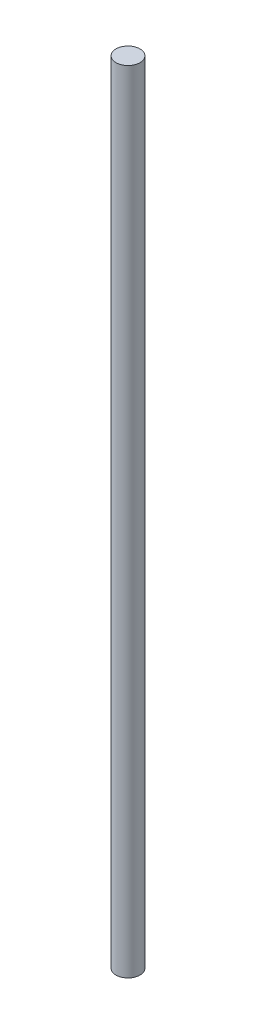
ISO-10303-21;
HEADER;
FILE_DESCRIPTION(('STEP AP214'),'2;1');
FILE_NAME('part.step','',(''),(''),'','','');
FILE_SCHEMA(('AUTOMOTIVE_DESIGN { 1 0 10303 214 1 1 1 1 }'));
ENDSEC;
DATA;
#1=APPLICATION_CONTEXT('core data for automotive mechanical design processes');
#2=APPLICATION_PROTOCOL_DEFINITION('international standard','automotive_design',2000,#1);
#3=PRODUCT_CONTEXT('',#1,'mechanical');
#4=PRODUCT('Part','Part','',(#3));
#5=PRODUCT_RELATED_PRODUCT_CATEGORY('part','',(#4));
#6=PRODUCT_DEFINITION_FORMATION('','',#4);
#7=PRODUCT_DEFINITION_CONTEXT('part definition',#1,'design');
#8=PRODUCT_DEFINITION('design','',#6,#7);
#9=PRODUCT_DEFINITION_SHAPE('','',#8);
#10=(LENGTH_UNIT() NAMED_UNIT(*) SI_UNIT(.MILLI.,.METRE.));
#11=(NAMED_UNIT(*) PLANE_ANGLE_UNIT() SI_UNIT($,.RADIAN.));
#12=(NAMED_UNIT(*) SI_UNIT($,.STERADIAN.) SOLID_ANGLE_UNIT());
#13=UNCERTAINTY_MEASURE_WITH_UNIT(LENGTH_MEASURE(1.E-05),#10,'distance_accuracy_value','');
#14=(GEOMETRIC_REPRESENTATION_CONTEXT(3) GLOBAL_UNCERTAINTY_ASSIGNED_CONTEXT((#13)) GLOBAL_UNIT_ASSIGNED_CONTEXT((#10,
#11,#12)) REPRESENTATION_CONTEXT('',''));
#15=CARTESIAN_POINT('',(0.,0.,0.));
#16=DIRECTION('',(0.,0.,1.));
#17=DIRECTION('',(1.,0.,0.));
#18=AXIS2_PLACEMENT_3D('',#15,#16,#17);
#19=CARTESIAN_POINT('',(0.,330.2,0.));
#20=DIRECTION('',(0.,-1.,0.));
#21=DIRECTION('',(0.,0.,-1.));
#22=AXIS2_PLACEMENT_3D('',#19,#20,#21);
#23=CYLINDRICAL_SURFACE('',#22,5.);
#24=CARTESIAN_POINT('',(0.,330.2,0.));
#25=DIRECTION('',(0.,1.,0.));
#26=DIRECTION('',(0.,0.,1.));
#27=AXIS2_PLACEMENT_3D('',#24,#25,#26);
#28=CIRCLE('',#27,5.);
#29=CARTESIAN_POINT('',(0.,330.2,5.));
#30=VERTEX_POINT('',#29);
#31=EDGE_CURVE('E10',#30,#30,#28,.T.);
#32=ORIENTED_EDGE('',*,*,#31,.F.);
#33=EDGE_LOOP('',(#32));
#34=FACE_BOUND('',#33,.T.);
#35=CARTESIAN_POINT('',(0.,0.,0.));
#36=DIRECTION('',(0.,1.,0.));
#37=DIRECTION('',(0.,0.,1.));
#38=AXIS2_PLACEMENT_3D('',#35,#36,#37);
#39=CIRCLE('',#38,5.);
#40=CARTESIAN_POINT('',(0.,0.,5.));
#41=VERTEX_POINT('',#40);
#42=EDGE_CURVE('E36',#41,#41,#39,.T.);
#43=ORIENTED_EDGE('',*,*,#42,.T.);
#44=EDGE_LOOP('',(#43));
#45=FACE_BOUND('',#44,.T.);
#46=ADVANCED_FACE('F33',(#34,#45),#23,.T.);
#47=CARTESIAN_POINT('',(0.,330.2,0.));
#48=DIRECTION('',(0.,1.,0.));
#49=DIRECTION('',(0.,0.,1.));
#50=AXIS2_PLACEMENT_3D('',#47,#48,#49);
#51=PLANE('',#50);
#52=ORIENTED_EDGE('',*,*,#31,.T.);
#53=EDGE_LOOP('',(#52));
#54=FACE_BOUND('',#53,.T.);
#55=ADVANCED_FACE('F48',(#54),#51,.T.);
#56=CARTESIAN_POINT('',(0.,0.,0.));
#57=DIRECTION('',(0.,1.,0.));
#58=DIRECTION('',(0.,0.,1.));
#59=AXIS2_PLACEMENT_3D('',#56,#57,#58);
#60=PLANE('',#59);
#61=ORIENTED_EDGE('',*,*,#42,.F.);
#62=EDGE_LOOP('',(#61));
#63=FACE_BOUND('',#62,.T.);
#64=ADVANCED_FACE('F46',(#63),#60,.F.);
#65=CLOSED_SHELL('',(#46,#55,#64));
#66=MANIFOLD_SOLID_BREP('B2',#65);
#67=ADVANCED_BREP_SHAPE_REPRESENTATION('',(#18,#66),#14);
#68=SHAPE_DEFINITION_REPRESENTATION(#9,#67);
ENDSEC;
END-ISO-10303-21;
